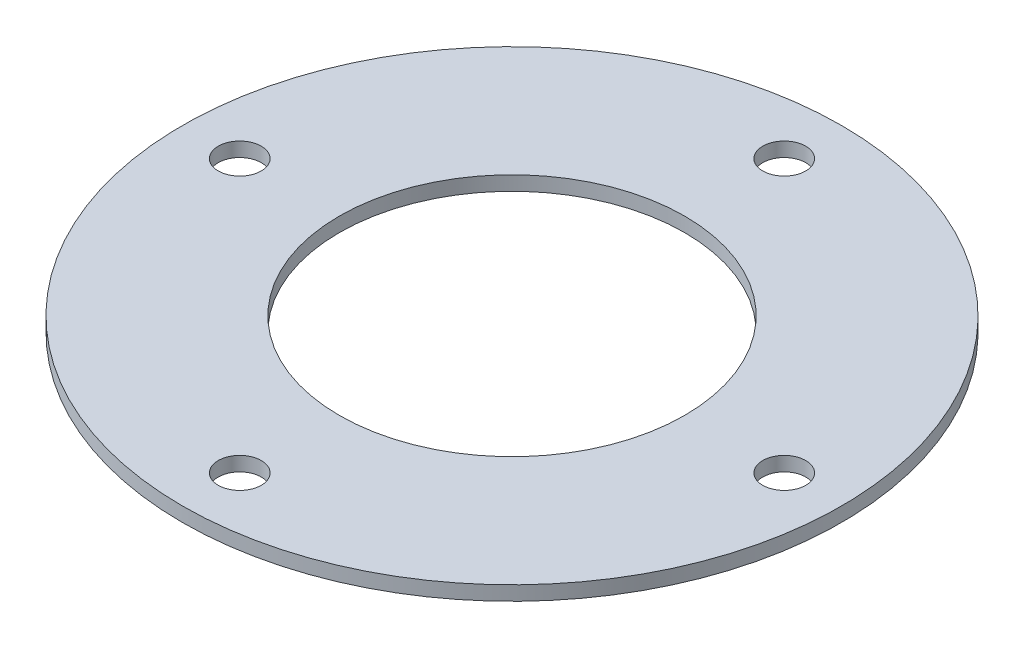
ISO-10303-21;
HEADER;
FILE_DESCRIPTION(('STEP AP214'),'2;1');
FILE_NAME('part.step','',(''),(''),'','','');
FILE_SCHEMA(('AUTOMOTIVE_DESIGN { 1 0 10303 214 1 1 1 1 }'));
ENDSEC;
DATA;
#1=APPLICATION_CONTEXT('core data for automotive mechanical design processes');
#2=APPLICATION_PROTOCOL_DEFINITION('international standard','automotive_design',2000,#1);
#3=PRODUCT_CONTEXT('',#1,'mechanical');
#4=PRODUCT('Part','Part','',(#3));
#5=PRODUCT_RELATED_PRODUCT_CATEGORY('part','',(#4));
#6=PRODUCT_DEFINITION_FORMATION('','',#4);
#7=PRODUCT_DEFINITION_CONTEXT('part definition',#1,'design');
#8=PRODUCT_DEFINITION('design','',#6,#7);
#9=PRODUCT_DEFINITION_SHAPE('','',#8);
#10=(LENGTH_UNIT() NAMED_UNIT(*) SI_UNIT(.MILLI.,.METRE.));
#11=(NAMED_UNIT(*) PLANE_ANGLE_UNIT() SI_UNIT($,.RADIAN.));
#12=(NAMED_UNIT(*) SI_UNIT($,.STERADIAN.) SOLID_ANGLE_UNIT());
#13=UNCERTAINTY_MEASURE_WITH_UNIT(LENGTH_MEASURE(1.E-05),#10,'distance_accuracy_value','');
#14=(GEOMETRIC_REPRESENTATION_CONTEXT(3) GLOBAL_UNCERTAINTY_ASSIGNED_CONTEXT((#13)) GLOBAL_UNIT_ASSIGNED_CONTEXT((#10,
#11,#12)) REPRESENTATION_CONTEXT('',''));
#15=CARTESIAN_POINT('',(0.,0.,0.));
#16=DIRECTION('',(0.,0.,1.));
#17=DIRECTION('',(1.,0.,0.));
#18=AXIS2_PLACEMENT_3D('',#15,#16,#17);
#19=CARTESIAN_POINT('',(0.,1.,0.));
#20=DIRECTION('',(0.,1.,0.));
#21=DIRECTION('',(0.,0.,1.));
#22=AXIS2_PLACEMENT_3D('',#19,#20,#21);
#23=PLANE('',#22);
#24=CARTESIAN_POINT('',(2.5545767853291E-13,1.,18.9999999999991));
#25=DIRECTION('',(0.,1.,0.));
#26=DIRECTION('',(0.,0.,1.));
#27=AXIS2_PLACEMENT_3D('',#24,#25,#26);
#28=CIRCLE('',#27,1.50000000000063);
#29=CARTESIAN_POINT('',(2.5545767853291E-13,1.,20.4999999999997));
#30=VERTEX_POINT('',#29);
#31=EDGE_CURVE('E58',#30,#30,#28,.T.);
#32=ORIENTED_EDGE('',*,*,#31,.F.);
#33=EDGE_LOOP('',(#32));
#34=FACE_BOUND('',#33,.T.);
#35=CARTESIAN_POINT('',(0.,1.,-19.));
#36=DIRECTION('',(0.,1.,0.));
#37=DIRECTION('',(0.,0.,1.));
#38=AXIS2_PLACEMENT_3D('',#35,#36,#37);
#39=CIRCLE('',#38,1.5);
#40=CARTESIAN_POINT('',(0.,1.,-17.5));
#41=VERTEX_POINT('',#40);
#42=EDGE_CURVE('E46',#41,#41,#39,.T.);
#43=ORIENTED_EDGE('',*,*,#42,.F.);
#44=EDGE_LOOP('',(#43));
#45=FACE_BOUND('',#44,.T.);
#46=CARTESIAN_POINT('',(0.,1.,0.));
#47=DIRECTION('',(0.,1.,0.));
#48=DIRECTION('',(0.,0.,1.));
#49=AXIS2_PLACEMENT_3D('',#46,#47,#48);
#50=CIRCLE('',#49,23.);
#51=CARTESIAN_POINT('',(0.,1.,23.));
#52=VERTEX_POINT('',#51);
#53=EDGE_CURVE('E10',#52,#52,#50,.T.);
#54=ORIENTED_EDGE('',*,*,#53,.T.);
#55=EDGE_LOOP('',(#54));
#56=FACE_BOUND('',#55,.T.);
#57=CARTESIAN_POINT('',(0.,1.,0.));
#58=DIRECTION('',(0.,1.,0.));
#59=DIRECTION('',(0.,0.,1.));
#60=AXIS2_PLACEMENT_3D('',#57,#58,#59);
#61=CIRCLE('',#60,12.05);
#62=CARTESIAN_POINT('',(0.,1.,12.05));
#63=VERTEX_POINT('',#62);
#64=EDGE_CURVE('E41',#63,#63,#61,.T.);
#65=ORIENTED_EDGE('',*,*,#64,.F.);
#66=EDGE_LOOP('',(#65));
#67=FACE_BOUND('',#66,.T.);
#68=CARTESIAN_POINT('',(18.9999999999997,1.,-5.6283914066096E-13));
#69=DIRECTION('',(0.,1.,0.));
#70=DIRECTION('',(0.,0.,1.));
#71=AXIS2_PLACEMENT_3D('',#68,#69,#70);
#72=CIRCLE('',#71,1.5000000000007);
#73=CARTESIAN_POINT('',(18.9999999999997,1.,1.50000000000013));
#74=VERTEX_POINT('',#73);
#75=EDGE_CURVE('E52',#74,#74,#72,.T.);
#76=ORIENTED_EDGE('',*,*,#75,.F.);
#77=EDGE_LOOP('',(#76));
#78=FACE_BOUND('',#77,.T.);
#79=CARTESIAN_POINT('',(-18.9999999999994,1.,-3.23012450120785E-13));
#80=DIRECTION('',(0.,1.,0.));
#81=DIRECTION('',(0.,0.,1.));
#82=AXIS2_PLACEMENT_3D('',#79,#80,#81);
#83=CIRCLE('',#82,1.50000000000005);
#84=CARTESIAN_POINT('',(-18.9999999999994,1.,1.49999999999973));
#85=VERTEX_POINT('',#84);
#86=EDGE_CURVE('E64',#85,#85,#83,.T.);
#87=ORIENTED_EDGE('',*,*,#86,.F.);
#88=EDGE_LOOP('',(#87));
#89=FACE_BOUND('',#88,.T.);
#90=ADVANCED_FACE('F30',(#34,#45,#56,#67,#78,#89),#23,.T.);
#91=CARTESIAN_POINT('',(0.,0.,0.));
#92=DIRECTION('',(0.,1.,0.));
#93=DIRECTION('',(0.,0.,1.));
#94=AXIS2_PLACEMENT_3D('',#91,#92,#93);
#95=PLANE('',#94);
#96=CARTESIAN_POINT('',(0.,0.,0.));
#97=DIRECTION('',(0.,1.,0.));
#98=DIRECTION('',(0.,0.,1.));
#99=AXIS2_PLACEMENT_3D('',#96,#97,#98);
#100=CIRCLE('',#99,23.);
#101=CARTESIAN_POINT('',(0.,0.,23.));
#102=VERTEX_POINT('',#101);
#103=EDGE_CURVE('E34',#102,#102,#100,.T.);
#104=ORIENTED_EDGE('',*,*,#103,.F.);
#105=EDGE_LOOP('',(#104));
#106=FACE_BOUND('',#105,.T.);
#107=CARTESIAN_POINT('',(0.,0.,0.));
#108=DIRECTION('',(0.,1.,0.));
#109=DIRECTION('',(0.,0.,1.));
#110=AXIS2_PLACEMENT_3D('',#107,#108,#109);
#111=CIRCLE('',#110,12.05);
#112=CARTESIAN_POINT('',(0.,0.,12.05));
#113=VERTEX_POINT('',#112);
#114=EDGE_CURVE('E43',#113,#113,#111,.T.);
#115=ORIENTED_EDGE('',*,*,#114,.T.);
#116=EDGE_LOOP('',(#115));
#117=FACE_BOUND('',#116,.T.);
#118=CARTESIAN_POINT('',(0.,0.,-19.));
#119=DIRECTION('',(0.,1.,0.));
#120=DIRECTION('',(0.,0.,1.));
#121=AXIS2_PLACEMENT_3D('',#118,#119,#120);
#122=CIRCLE('',#121,1.5);
#123=CARTESIAN_POINT('',(0.,0.,-17.5));
#124=VERTEX_POINT('',#123);
#125=EDGE_CURVE('E49',#124,#124,#122,.T.);
#126=ORIENTED_EDGE('',*,*,#125,.T.);
#127=EDGE_LOOP('',(#126));
#128=FACE_BOUND('',#127,.T.);
#129=CARTESIAN_POINT('',(18.9999999999997,0.,-5.6283914066096E-13));
#130=DIRECTION('',(0.,1.,0.));
#131=DIRECTION('',(0.,0.,1.));
#132=AXIS2_PLACEMENT_3D('',#129,#130,#131);
#133=CIRCLE('',#132,1.5000000000007);
#134=CARTESIAN_POINT('',(18.9999999999997,0.,1.50000000000013));
#135=VERTEX_POINT('',#134);
#136=EDGE_CURVE('E55',#135,#135,#133,.T.);
#137=ORIENTED_EDGE('',*,*,#136,.T.);
#138=EDGE_LOOP('',(#137));
#139=FACE_BOUND('',#138,.T.);
#140=CARTESIAN_POINT('',(2.5545767853291E-13,0.,18.9999999999991));
#141=DIRECTION('',(0.,1.,0.));
#142=DIRECTION('',(0.,0.,1.));
#143=AXIS2_PLACEMENT_3D('',#140,#141,#142);
#144=CIRCLE('',#143,1.50000000000063);
#145=CARTESIAN_POINT('',(2.5545767853291E-13,0.,20.4999999999997));
#146=VERTEX_POINT('',#145);
#147=EDGE_CURVE('E61',#146,#146,#144,.T.);
#148=ORIENTED_EDGE('',*,*,#147,.T.);
#149=EDGE_LOOP('',(#148));
#150=FACE_BOUND('',#149,.T.);
#151=CARTESIAN_POINT('',(-18.9999999999994,0.,-3.23012450120785E-13));
#152=DIRECTION('',(0.,1.,0.));
#153=DIRECTION('',(0.,0.,1.));
#154=AXIS2_PLACEMENT_3D('',#151,#152,#153);
#155=CIRCLE('',#154,1.50000000000005);
#156=CARTESIAN_POINT('',(-18.9999999999994,0.,1.49999999999973));
#157=VERTEX_POINT('',#156);
#158=EDGE_CURVE('E67',#157,#157,#155,.T.);
#159=ORIENTED_EDGE('',*,*,#158,.T.);
#160=EDGE_LOOP('',(#159));
#161=FACE_BOUND('',#160,.T.);
#162=ADVANCED_FACE('F77',(#106,#117,#128,#139,#150,#161),#95,.F.);
#163=CARTESIAN_POINT('',(0.,1.,0.));
#164=DIRECTION('',(0.,-1.,0.));
#165=DIRECTION('',(0.,0.,-1.));
#166=AXIS2_PLACEMENT_3D('',#163,#164,#165);
#167=CYLINDRICAL_SURFACE('',#166,23.);
#168=ORIENTED_EDGE('',*,*,#53,.F.);
#169=EDGE_LOOP('',(#168));
#170=FACE_BOUND('',#169,.T.);
#171=ORIENTED_EDGE('',*,*,#103,.T.);
#172=EDGE_LOOP('',(#171));
#173=FACE_BOUND('',#172,.T.);
#174=ADVANCED_FACE('F32',(#170,#173),#167,.T.);
#175=CARTESIAN_POINT('',(0.,1.,0.));
#176=DIRECTION('',(0.,-1.,0.));
#177=DIRECTION('',(0.,0.,-1.));
#178=AXIS2_PLACEMENT_3D('',#175,#176,#177);
#179=CYLINDRICAL_SURFACE('',#178,12.05);
#180=ORIENTED_EDGE('',*,*,#64,.T.);
#181=EDGE_LOOP('',(#180));
#182=FACE_BOUND('',#181,.T.);
#183=ORIENTED_EDGE('',*,*,#114,.F.);
#184=EDGE_LOOP('',(#183));
#185=FACE_BOUND('',#184,.T.);
#186=ADVANCED_FACE('F87',(#182,#185),#179,.F.);
#187=CARTESIAN_POINT('',(0.,1.,-19.));
#188=DIRECTION('',(0.,-1.,0.));
#189=DIRECTION('',(0.,0.,-1.));
#190=AXIS2_PLACEMENT_3D('',#187,#188,#189);
#191=CYLINDRICAL_SURFACE('',#190,1.5);
#192=ORIENTED_EDGE('',*,*,#42,.T.);
#193=EDGE_LOOP('',(#192));
#194=FACE_BOUND('',#193,.T.);
#195=ORIENTED_EDGE('',*,*,#125,.F.);
#196=EDGE_LOOP('',(#195));
#197=FACE_BOUND('',#196,.T.);
#198=ADVANCED_FACE('F90',(#194,#197),#191,.F.);
#199=CARTESIAN_POINT('',(18.9999999999997,1.,-5.6283914066096E-13));
#200=DIRECTION('',(0.,-1.,0.));
#201=DIRECTION('',(0.,0.,-1.));
#202=AXIS2_PLACEMENT_3D('',#199,#200,#201);
#203=CYLINDRICAL_SURFACE('',#202,1.5000000000007);
#204=ORIENTED_EDGE('',*,*,#75,.T.);
#205=EDGE_LOOP('',(#204));
#206=FACE_BOUND('',#205,.T.);
#207=ORIENTED_EDGE('',*,*,#136,.F.);
#208=EDGE_LOOP('',(#207));
#209=FACE_BOUND('',#208,.T.);
#210=ADVANCED_FACE('F94',(#206,#209),#203,.F.);
#211=CARTESIAN_POINT('',(2.5545767853291E-13,1.,18.9999999999991));
#212=DIRECTION('',(0.,-1.,0.));
#213=DIRECTION('',(0.,0.,-1.));
#214=AXIS2_PLACEMENT_3D('',#211,#212,#213);
#215=CYLINDRICAL_SURFACE('',#214,1.50000000000063);
#216=ORIENTED_EDGE('',*,*,#31,.T.);
#217=EDGE_LOOP('',(#216));
#218=FACE_BOUND('',#217,.T.);
#219=ORIENTED_EDGE('',*,*,#147,.F.);
#220=EDGE_LOOP('',(#219));
#221=FACE_BOUND('',#220,.T.);
#222=ADVANCED_FACE('F98',(#218,#221),#215,.F.);
#223=CARTESIAN_POINT('',(-18.9999999999994,1.,-3.23012450120785E-13));
#224=DIRECTION('',(0.,-1.,0.));
#225=DIRECTION('',(0.,0.,-1.));
#226=AXIS2_PLACEMENT_3D('',#223,#224,#225);
#227=CYLINDRICAL_SURFACE('',#226,1.50000000000005);
#228=ORIENTED_EDGE('',*,*,#86,.T.);
#229=EDGE_LOOP('',(#228));
#230=FACE_BOUND('',#229,.T.);
#231=ORIENTED_EDGE('',*,*,#158,.F.);
#232=EDGE_LOOP('',(#231));
#233=FACE_BOUND('',#232,.T.);
#234=ADVANCED_FACE('F73',(#230,#233),#227,.F.);
#235=CLOSED_SHELL('',(#90,#162,#174,#186,#198,#210,#222,#234));
#236=MANIFOLD_SOLID_BREP('B2',#235);
#237=ADVANCED_BREP_SHAPE_REPRESENTATION('',(#18,#236),#14);
#238=SHAPE_DEFINITION_REPRESENTATION(#9,#237);
ENDSEC;
END-ISO-10303-21;
